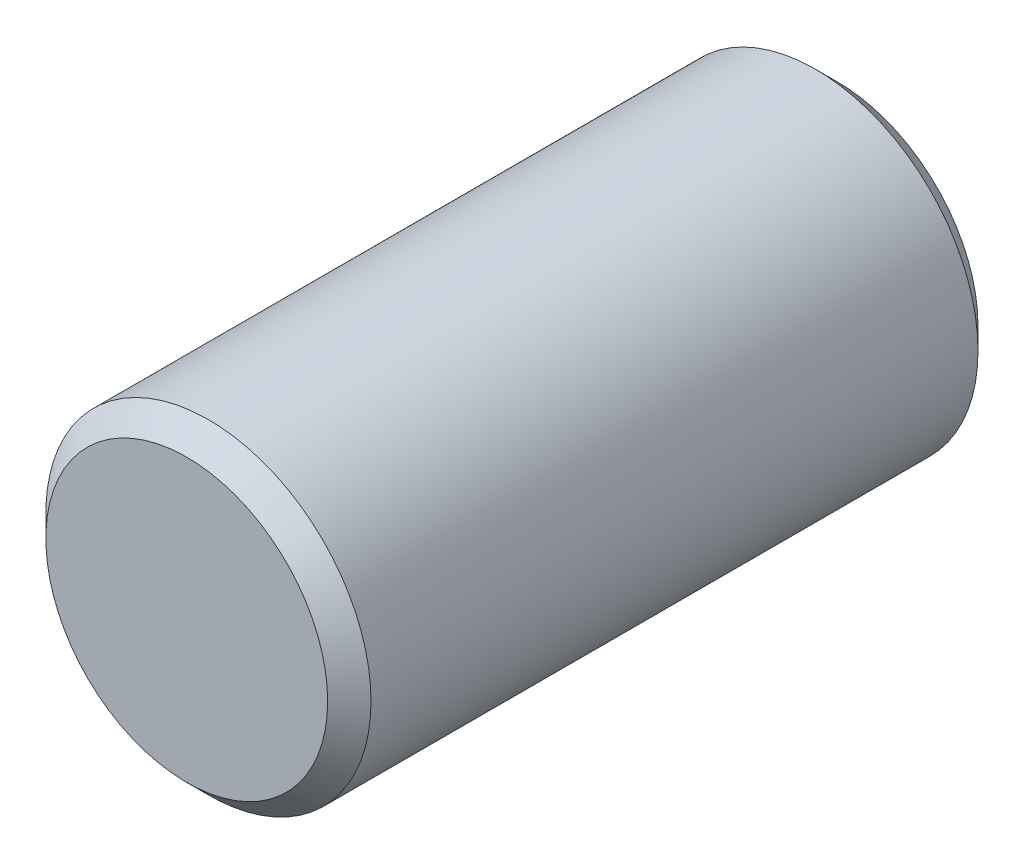
ISO-10303-21;
HEADER;
FILE_DESCRIPTION(('STEP AP214'),'2;1');
FILE_NAME('part.step','',(''),(''),'','','');
FILE_SCHEMA(('AUTOMOTIVE_DESIGN { 1 0 10303 214 1 1 1 1 }'));
ENDSEC;
DATA;
#1=APPLICATION_CONTEXT('core data for automotive mechanical design processes');
#2=APPLICATION_PROTOCOL_DEFINITION('international standard','automotive_design',2000,#1);
#3=PRODUCT_CONTEXT('',#1,'mechanical');
#4=PRODUCT('Part','Part','',(#3));
#5=PRODUCT_RELATED_PRODUCT_CATEGORY('part','',(#4));
#6=PRODUCT_DEFINITION_FORMATION('','',#4);
#7=PRODUCT_DEFINITION_CONTEXT('part definition',#1,'design');
#8=PRODUCT_DEFINITION('design','',#6,#7);
#9=PRODUCT_DEFINITION_SHAPE('','',#8);
#10=(LENGTH_UNIT() NAMED_UNIT(*) SI_UNIT(.MILLI.,.METRE.));
#11=(NAMED_UNIT(*) PLANE_ANGLE_UNIT() SI_UNIT($,.RADIAN.));
#12=(NAMED_UNIT(*) SI_UNIT($,.STERADIAN.) SOLID_ANGLE_UNIT());
#13=UNCERTAINTY_MEASURE_WITH_UNIT(LENGTH_MEASURE(1.E-05),#10,'distance_accuracy_value','');
#14=(GEOMETRIC_REPRESENTATION_CONTEXT(3) GLOBAL_UNCERTAINTY_ASSIGNED_CONTEXT((#13)) GLOBAL_UNIT_ASSIGNED_CONTEXT((#10,
#11,#12)) REPRESENTATION_CONTEXT('',''));
#15=CARTESIAN_POINT('',(0.,0.,0.));
#16=DIRECTION('',(0.,0.,1.));
#17=DIRECTION('',(1.,0.,0.));
#18=AXIS2_PLACEMENT_3D('',#15,#16,#17);
#19=CARTESIAN_POINT('',(0.,0.,6.));
#20=DIRECTION('',(0.,0.,-1.));
#21=DIRECTION('',(-1.,0.,0.));
#22=AXIS2_PLACEMENT_3D('',#19,#20,#21);
#23=CYLINDRICAL_SURFACE('',#22,1.5);
#24=CARTESIAN_POINT('',(0.,0.,0.2));
#25=DIRECTION('',(0.,0.,1.));
#26=DIRECTION('',(1.,0.,0.));
#27=AXIS2_PLACEMENT_3D('',#24,#25,#26);
#28=CIRCLE('',#27,1.5);
#29=CARTESIAN_POINT('',(1.5,0.,0.2));
#30=VERTEX_POINT('',#29);
#31=EDGE_CURVE('E46',#30,#30,#28,.T.);
#32=ORIENTED_EDGE('',*,*,#31,.T.);
#33=EDGE_LOOP('',(#32));
#34=FACE_BOUND('',#33,.T.);
#35=CARTESIAN_POINT('',(0.,0.,5.8));
#36=DIRECTION('',(0.,0.,1.));
#37=DIRECTION('',(1.,0.,0.));
#38=AXIS2_PLACEMENT_3D('',#35,#36,#37);
#39=CIRCLE('',#38,1.5);
#40=CARTESIAN_POINT('',(1.5,0.,5.8));
#41=VERTEX_POINT('',#40);
#42=EDGE_CURVE('E50',#41,#41,#39,.F.);
#43=ORIENTED_EDGE('',*,*,#42,.T.);
#44=EDGE_LOOP('',(#43));
#45=FACE_BOUND('',#44,.T.);
#46=ADVANCED_FACE('F36',(#34,#45),#23,.T.);
#47=CARTESIAN_POINT('',(0.,0.,6.));
#48=DIRECTION('',(0.,0.,1.));
#49=DIRECTION('',(1.,0.,0.));
#50=AXIS2_PLACEMENT_3D('',#47,#48,#49);
#51=PLANE('',#50);
#52=CARTESIAN_POINT('',(0.,0.,6.));
#53=DIRECTION('',(0.,0.,1.));
#54=DIRECTION('',(1.,0.,0.));
#55=AXIS2_PLACEMENT_3D('',#52,#53,#54);
#56=CIRCLE('',#55,1.3);
#57=CARTESIAN_POINT('',(1.3,0.,6.));
#58=VERTEX_POINT('',#57);
#59=EDGE_CURVE('E10',#58,#58,#56,.T.);
#60=ORIENTED_EDGE('',*,*,#59,.T.);
#61=EDGE_LOOP('',(#60));
#62=FACE_BOUND('',#61,.T.);
#63=ADVANCED_FACE('F69',(#62),#51,.T.);
#64=CARTESIAN_POINT('',(0.,0.,0.));
#65=DIRECTION('',(0.,0.,1.));
#66=DIRECTION('',(1.,0.,0.));
#67=AXIS2_PLACEMENT_3D('',#64,#65,#66);
#68=PLANE('',#67);
#69=CARTESIAN_POINT('',(0.,0.,0.));
#70=DIRECTION('',(0.,0.,1.));
#71=DIRECTION('',(1.,0.,0.));
#72=AXIS2_PLACEMENT_3D('',#69,#70,#71);
#73=CIRCLE('',#72,1.3);
#74=CARTESIAN_POINT('',(1.3,0.,0.));
#75=VERTEX_POINT('',#74);
#76=EDGE_CURVE('E42',#75,#75,#73,.F.);
#77=ORIENTED_EDGE('',*,*,#76,.T.);
#78=EDGE_LOOP('',(#77));
#79=FACE_BOUND('',#78,.T.);
#80=ADVANCED_FACE('F65',(#79),#68,.F.);
#81=CARTESIAN_POINT('',(0.,0.,0.2));
#82=DIRECTION('',(0.,0.,1.));
#83=DIRECTION('',(1.,0.,0.));
#84=AXIS2_PLACEMENT_3D('',#81,#82,#83);
#85=CONICAL_SURFACE('',#84,1.5,0.78539816339745);
#86=CARTESIAN_POINT('',(1.3,0.,0.));
#87=CARTESIAN_POINT('',(1.30208333333333,0.,0.0020833333333333));
#88=CARTESIAN_POINT('',(1.30416666666667,0.,0.00416666666666663));
#89=CARTESIAN_POINT('',(1.30833333333333,0.,0.00833333333333329));
#90=CARTESIAN_POINT('',(1.31041666666667,0.,0.0104166666666666));
#91=CARTESIAN_POINT('',(1.31458333333333,0.,0.0145833333333333));
#92=CARTESIAN_POINT('',(1.31666666666667,0.,0.0166666666666666));
#93=CARTESIAN_POINT('',(1.32083333333333,0.,0.0208333333333333));
#94=CARTESIAN_POINT('',(1.32291666666667,0.,0.0229166666666666));
#95=CARTESIAN_POINT('',(1.32708333333333,0.,0.0270833333333333));
#96=CARTESIAN_POINT('',(1.32916666666667,0.,0.0291666666666666));
#97=CARTESIAN_POINT('',(1.33333333333333,0.,0.0333333333333332));
#98=CARTESIAN_POINT('',(1.33541666666667,0.,0.0354166666666666));
#99=CARTESIAN_POINT('',(1.33958333333333,0.,0.0395833333333333));
#100=CARTESIAN_POINT('',(1.34166666666667,0.,0.0416666666666666));
#101=CARTESIAN_POINT('',(1.34583333333333,0.,0.0458333333333333));
#102=CARTESIAN_POINT('',(1.34791666666667,0.,0.0479166666666665));
#103=CARTESIAN_POINT('',(1.35208333333333,0.,0.0520833333333332));
#104=CARTESIAN_POINT('',(1.35416666666667,0.,0.0541666666666666));
#105=CARTESIAN_POINT('',(1.35833333333333,0.,0.0583333333333332));
#106=CARTESIAN_POINT('',(1.36041666666667,0.,0.0604166666666665));
#107=CARTESIAN_POINT('',(1.36458333333333,0.,0.0645833333333332));
#108=CARTESIAN_POINT('',(1.36666666666667,0.,0.0666666666666665));
#109=CARTESIAN_POINT('',(1.37083333333333,0.,0.0708333333333332));
#110=CARTESIAN_POINT('',(1.37291666666667,0.,0.0729166666666666));
#111=CARTESIAN_POINT('',(1.37708333333333,0.,0.0770833333333332));
#112=CARTESIAN_POINT('',(1.37916666666667,0.,0.0791666666666665));
#113=CARTESIAN_POINT('',(1.38333333333333,0.,0.0833333333333331));
#114=CARTESIAN_POINT('',(1.38541666666667,0.,0.0854166666666665));
#115=CARTESIAN_POINT('',(1.38958333333333,0.,0.0895833333333332));
#116=CARTESIAN_POINT('',(1.39166666666667,0.,0.0916666666666665));
#117=CARTESIAN_POINT('',(1.39583333333333,0.,0.0958333333333332));
#118=CARTESIAN_POINT('',(1.39791666666667,0.,0.0979166666666665));
#119=CARTESIAN_POINT('',(1.40208333333333,0.,0.102083333333333));
#120=CARTESIAN_POINT('',(1.40416666666667,0.,0.104166666666666));
#121=CARTESIAN_POINT('',(1.40833333333333,0.,0.108333333333333));
#122=CARTESIAN_POINT('',(1.41041666666667,0.,0.110416666666666));
#123=CARTESIAN_POINT('',(1.41458333333333,0.,0.114583333333333));
#124=CARTESIAN_POINT('',(1.41666666666667,0.,0.116666666666666));
#125=CARTESIAN_POINT('',(1.42083333333333,0.,0.120833333333333));
#126=CARTESIAN_POINT('',(1.42291666666667,0.,0.122916666666666));
#127=CARTESIAN_POINT('',(1.42708333333333,0.,0.127083333333333));
#128=CARTESIAN_POINT('',(1.42916666666667,0.,0.129166666666666));
#129=CARTESIAN_POINT('',(1.43333333333333,0.,0.133333333333333));
#130=CARTESIAN_POINT('',(1.43541666666667,0.,0.135416666666666));
#131=CARTESIAN_POINT('',(1.43958333333333,0.,0.139583333333333));
#132=CARTESIAN_POINT('',(1.44166666666667,0.,0.141666666666666));
#133=CARTESIAN_POINT('',(1.44583333333333,0.,0.145833333333333));
#134=CARTESIAN_POINT('',(1.44791666666667,0.,0.147916666666666));
#135=CARTESIAN_POINT('',(1.45208333333333,0.,0.152083333333333));
#136=CARTESIAN_POINT('',(1.45416666666667,0.,0.154166666666666));
#137=CARTESIAN_POINT('',(1.45833333333333,0.,0.158333333333333));
#138=CARTESIAN_POINT('',(1.46041666666667,0.,0.160416666666666));
#139=CARTESIAN_POINT('',(1.46458333333333,0.,0.164583333333333));
#140=CARTESIAN_POINT('',(1.46666666666667,0.,0.166666666666666));
#141=CARTESIAN_POINT('',(1.47083333333333,0.,0.170833333333333));
#142=CARTESIAN_POINT('',(1.47291666666667,0.,0.172916666666666));
#143=CARTESIAN_POINT('',(1.47708333333333,0.,0.177083333333333));
#144=CARTESIAN_POINT('',(1.47916666666667,0.,0.179166666666666));
#145=CARTESIAN_POINT('',(1.48333333333333,0.,0.183333333333333));
#146=CARTESIAN_POINT('',(1.48541666666667,0.,0.185416666666666));
#147=CARTESIAN_POINT('',(1.48958333333333,0.,0.189583333333333));
#148=CARTESIAN_POINT('',(1.49166666666667,0.,0.191666666666666));
#149=CARTESIAN_POINT('',(1.49583333333333,0.,0.195833333333333));
#150=CARTESIAN_POINT('',(1.49791666666667,0.,0.197916666666666));
#151=CARTESIAN_POINT('',(1.5,0.,0.2));
#152=B_SPLINE_CURVE_WITH_KNOTS('',3,(#86,#87,#88,#89,#90,#91,#92,#93,#94,#95,#96,#97,#98,#99,
#100,#101,#102,#103,#104,#105,#106,#107,#108,#109,#110,#111,#112,#113,#114,#115,#116,#117,#118,
#119,#120,#121,#122,#123,#124,#125,#126,#127,#128,#129,#130,#131,#132,#133,#134,#135,#136,#137,
#138,#139,#140,#141,#142,#143,#144,#145,#146,#147,#148,#149,#150,#151),.UNSPECIFIED.,.F.,.F.,(4,
2,2,2,2,2,2,2,2,2,2,2,2,2,2,2,2,2,2,2,2,2,2,2,2,2,2,2,2,2,2,2,4),(0.,0.00883883476483181,
0.0176776695296636,0.0265165042944954,0.0353553390593272,0.0441941738241592,0.053033008588991,
0.0618718433538228,0.0707106781186548,0.0795495128834866,0.0883883476483184,0.0972271824131502,
0.106066017177982,0.114904851942814,0.123743686707646,0.132582521472478,0.141421356237309,
0.150260191002141,0.159099025766973,0.167937860531805,0.176776695296637,0.185615530061469,
0.194454364826301,0.203293199591132,0.212132034355964,0.220970869120796,0.229809703885628,
0.23864853865046,0.247487373415292,0.256326208180123,0.265165042944955,0.274003877709787,
0.282842712474619),.UNSPECIFIED.);
#153=EDGE_CURVE('BSEAM60',#75,#30,#152,.T.);
#154=ORIENTED_EDGE('',*,*,#76,.F.);
#155=ORIENTED_EDGE('',*,*,#31,.F.);
#156=ORIENTED_EDGE('',*,*,#153,.T.);
#157=ORIENTED_EDGE('',*,*,#153,.F.);
#158=EDGE_LOOP('',(#154,#156,#155,#157));
#159=FACE_BOUND('',#158,.T.);
#160=ADVANCED_FACE('F60',(#159),#85,.T.);
#161=CARTESIAN_POINT('',(0.,0.,6.));
#162=DIRECTION('',(0.,0.,-1.));
#163=DIRECTION('',(-1.,0.,0.));
#164=AXIS2_PLACEMENT_3D('',#161,#162,#163);
#165=CONICAL_SURFACE('',#164,1.3,0.785398163397447);
#166=ORIENTED_EDGE('',*,*,#42,.F.);
#167=EDGE_LOOP('',(#166));
#168=FACE_BOUND('',#167,.T.);
#169=ORIENTED_EDGE('',*,*,#59,.F.);
#170=EDGE_LOOP('',(#169));
#171=FACE_BOUND('',#170,.T.);
#172=ADVANCED_FACE('F57',(#168,#171),#165,.T.);
#173=CLOSED_SHELL('',(#46,#63,#80,#160,#172));
#174=MANIFOLD_SOLID_BREP('B2',#173);
#175=ADVANCED_BREP_SHAPE_REPRESENTATION('',(#18,#174),#14);
#176=SHAPE_DEFINITION_REPRESENTATION(#9,#175);
ENDSEC;
END-ISO-10303-21;
